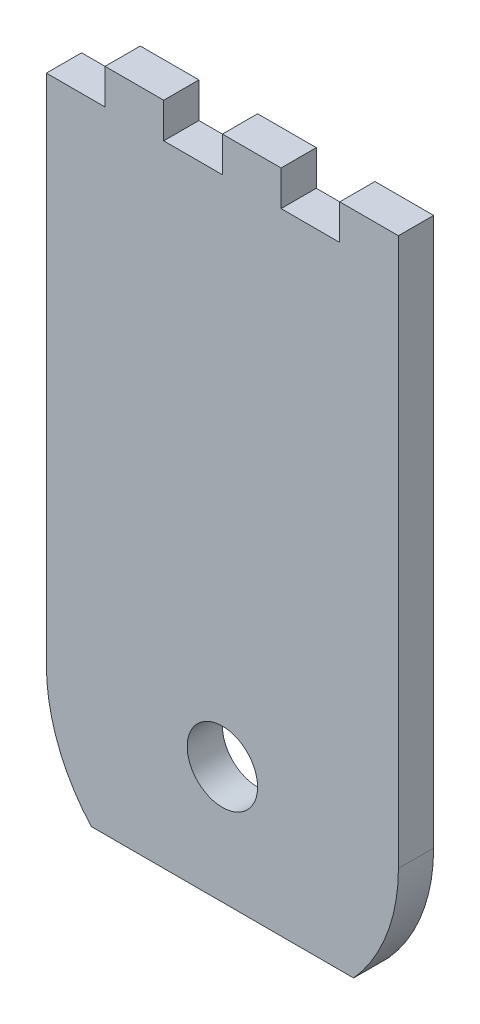
ISO-10303-21;
HEADER;
FILE_DESCRIPTION(('STEP AP214'),'2;1');
FILE_NAME('part.step','',(''),(''),'','','');
FILE_SCHEMA(('AUTOMOTIVE_DESIGN { 1 0 10303 214 1 1 1 1 }'));
ENDSEC;
DATA;
#1=APPLICATION_CONTEXT('core data for automotive mechanical design processes');
#2=APPLICATION_PROTOCOL_DEFINITION('international standard','automotive_design',2000,#1);
#3=PRODUCT_CONTEXT('',#1,'mechanical');
#4=PRODUCT('Part','Part','',(#3));
#5=PRODUCT_RELATED_PRODUCT_CATEGORY('part','',(#4));
#6=PRODUCT_DEFINITION_FORMATION('','',#4);
#7=PRODUCT_DEFINITION_CONTEXT('part definition',#1,'design');
#8=PRODUCT_DEFINITION('design','',#6,#7);
#9=PRODUCT_DEFINITION_SHAPE('','',#8);
#10=(LENGTH_UNIT() NAMED_UNIT(*) SI_UNIT(.MILLI.,.METRE.));
#11=(NAMED_UNIT(*) PLANE_ANGLE_UNIT() SI_UNIT($,.RADIAN.));
#12=(NAMED_UNIT(*) SI_UNIT($,.STERADIAN.) SOLID_ANGLE_UNIT());
#13=UNCERTAINTY_MEASURE_WITH_UNIT(LENGTH_MEASURE(1.E-05),#10,'distance_accuracy_value','');
#14=(GEOMETRIC_REPRESENTATION_CONTEXT(3) GLOBAL_UNCERTAINTY_ASSIGNED_CONTEXT((#13)) GLOBAL_UNIT_ASSIGNED_CONTEXT((#10,
#11,#12)) REPRESENTATION_CONTEXT('',''));
#15=CARTESIAN_POINT('',(0.,0.,0.));
#16=DIRECTION('',(0.,0.,1.));
#17=DIRECTION('',(1.,0.,0.));
#18=AXIS2_PLACEMENT_3D('',#15,#16,#17);
#19=CARTESIAN_POINT('',(0.,0.,3.));
#20=DIRECTION('',(0.,0.,1.));
#21=DIRECTION('',(1.,0.,0.));
#22=AXIS2_PLACEMENT_3D('',#19,#20,#21);
#23=PLANE('',#22);
#24=CARTESIAN_POINT('',(0.,-18.345,3.));
#25=DIRECTION('',(0.,0.,1.));
#26=DIRECTION('',(1.,0.,0.));
#27=AXIS2_PLACEMENT_3D('',#24,#25,#26);
#28=CIRCLE('',#27,3.);
#29=CARTESIAN_POINT('',(3.00000000000001,-18.345,3.));
#30=VERTEX_POINT('',#29);
#31=EDGE_CURVE('E178',#30,#30,#28,.T.);
#32=ORIENTED_EDGE('',*,*,#31,.F.);
#33=EDGE_LOOP('',(#32));
#34=FACE_BOUND('',#33,.T.);
#35=CARTESIAN_POINT('',(0.,-18.345,3.));
#36=DIRECTION('',(0.,0.,1.));
#37=DIRECTION('',(-1.,0.,0.));
#38=AXIS2_PLACEMENT_3D('',#35,#36,#37);
#39=CIRCLE('',#38,15.);
#40=CARTESIAN_POINT('',(11.180339887499,-28.345,3.));
#41=VERTEX_POINT('',#40);
#42=CARTESIAN_POINT('',(15.,-18.345,3.));
#43=VERTEX_POINT('',#42);
#44=EDGE_CURVE('E146',#41,#43,#39,.T.);
#45=ORIENTED_EDGE('',*,*,#44,.T.);
#46=DIRECTION('',(0.,1.,0.));
#47=VECTOR('',#46,1.);
#48=CARTESIAN_POINT('',(15.,-28.345,3.));
#49=LINE('',#48,#47);
#50=CARTESIAN_POINT('',(15.,28.345,3.));
#51=VERTEX_POINT('',#50);
#52=EDGE_CURVE('E157',#43,#51,#49,.T.);
#53=ORIENTED_EDGE('',*,*,#52,.T.);
#54=DIRECTION('',(-1.,0.,0.));
#55=VECTOR('',#54,1.);
#56=CARTESIAN_POINT('',(10.,28.345,3.));
#57=LINE('',#56,#55);
#58=CARTESIAN_POINT('',(10.,28.345,3.));
#59=VERTEX_POINT('',#58);
#60=EDGE_CURVE('E205',#51,#59,#57,.T.);
#61=ORIENTED_EDGE('',*,*,#60,.T.);
#62=DIRECTION('',(0.,-1.,0.));
#63=VECTOR('',#62,1.);
#64=CARTESIAN_POINT('',(10.,25.345,3.));
#65=LINE('',#64,#63);
#66=CARTESIAN_POINT('',(10.,25.345,3.));
#67=VERTEX_POINT('',#66);
#68=EDGE_CURVE('E294',#59,#67,#65,.T.);
#69=ORIENTED_EDGE('',*,*,#68,.T.);
#70=DIRECTION('',(-1.,0.,0.));
#71=VECTOR('',#70,1.);
#72=CARTESIAN_POINT('',(5.,25.345,3.));
#73=LINE('',#72,#71);
#74=CARTESIAN_POINT('',(5.,25.345,3.));
#75=VERTEX_POINT('',#74);
#76=EDGE_CURVE('E239',#67,#75,#73,.T.);
#77=ORIENTED_EDGE('',*,*,#76,.T.);
#78=DIRECTION('',(0.,1.,0.));
#79=VECTOR('',#78,1.);
#80=CARTESIAN_POINT('',(5.,28.345,3.));
#81=LINE('',#80,#79);
#82=CARTESIAN_POINT('',(5.,28.345,3.));
#83=VERTEX_POINT('',#82);
#84=EDGE_CURVE('E258',#75,#83,#81,.T.);
#85=ORIENTED_EDGE('',*,*,#84,.T.);
#86=DIRECTION('',(-1.,0.,0.));
#87=VECTOR('',#86,1.);
#88=CARTESIAN_POINT('',(0.,28.345,3.));
#89=LINE('',#88,#87);
#90=CARTESIAN_POINT('',(0.,28.345,3.));
#91=VERTEX_POINT('',#90);
#92=EDGE_CURVE('E255',#83,#91,#89,.T.);
#93=ORIENTED_EDGE('',*,*,#92,.T.);
#94=DIRECTION('',(0.,-1.,0.));
#95=VECTOR('',#94,1.);
#96=CARTESIAN_POINT('',(0.,25.345,3.));
#97=LINE('',#96,#95);
#98=CARTESIAN_POINT('',(0.,25.345,3.));
#99=VERTEX_POINT('',#98);
#100=EDGE_CURVE('E257',#91,#99,#97,.T.);
#101=ORIENTED_EDGE('',*,*,#100,.T.);
#102=DIRECTION('',(-1.,0.,0.));
#103=VECTOR('',#102,1.);
#104=CARTESIAN_POINT('',(-5.,25.345,3.));
#105=LINE('',#104,#103);
#106=CARTESIAN_POINT('',(-5.,25.345,3.));
#107=VERTEX_POINT('',#106);
#108=EDGE_CURVE('E260',#99,#107,#105,.T.);
#109=ORIENTED_EDGE('',*,*,#108,.T.);
#110=DIRECTION('',(0.,1.,0.));
#111=VECTOR('',#110,1.);
#112=CARTESIAN_POINT('',(-5.,28.345,3.));
#113=LINE('',#112,#111);
#114=CARTESIAN_POINT('',(-5.,28.345,3.));
#115=VERTEX_POINT('',#114);
#116=EDGE_CURVE('E266',#107,#115,#113,.T.);
#117=ORIENTED_EDGE('',*,*,#116,.T.);
#118=DIRECTION('',(-1.,0.,0.));
#119=VECTOR('',#118,1.);
#120=CARTESIAN_POINT('',(-10.,28.345,3.));
#121=LINE('',#120,#119);
#122=CARTESIAN_POINT('',(-10.,28.345,3.));
#123=VERTEX_POINT('',#122);
#124=EDGE_CURVE('E268',#115,#123,#121,.T.);
#125=ORIENTED_EDGE('',*,*,#124,.T.);
#126=DIRECTION('',(0.,-1.,0.));
#127=VECTOR('',#126,1.);
#128=CARTESIAN_POINT('',(-10.,25.345,3.));
#129=LINE('',#128,#127);
#130=CARTESIAN_POINT('',(-10.,25.345,3.));
#131=VERTEX_POINT('',#130);
#132=EDGE_CURVE('E270',#123,#131,#129,.T.);
#133=ORIENTED_EDGE('',*,*,#132,.T.);
#134=DIRECTION('',(-1.,0.,0.));
#135=VECTOR('',#134,1.);
#136=CARTESIAN_POINT('',(-15.,25.345,3.));
#137=LINE('',#136,#135);
#138=CARTESIAN_POINT('',(-15.,25.345,3.));
#139=VERTEX_POINT('',#138);
#140=EDGE_CURVE('E272',#131,#139,#137,.T.);
#141=ORIENTED_EDGE('',*,*,#140,.T.);
#142=DIRECTION('',(0.,-1.,0.));
#143=VECTOR('',#142,1.);
#144=CARTESIAN_POINT('',(-15.,-28.345,3.));
#145=LINE('',#144,#143);
#146=CARTESIAN_POINT('',(-15.,-18.345,3.));
#147=VERTEX_POINT('',#146);
#148=EDGE_CURVE('E170',#139,#147,#145,.T.);
#149=ORIENTED_EDGE('',*,*,#148,.T.);
#150=CARTESIAN_POINT('',(-11.1803398874989,-28.345,3.));
#151=VERTEX_POINT('',#150);
#152=EDGE_CURVE('E152',#147,#151,#39,.T.);
#153=ORIENTED_EDGE('',*,*,#152,.T.);
#154=DIRECTION('',(1.,0.,0.));
#155=VECTOR('',#154,1.);
#156=CARTESIAN_POINT('',(-15.,-28.345,3.));
#157=LINE('',#156,#155);
#158=EDGE_CURVE('E161',#151,#41,#157,.T.);
#159=ORIENTED_EDGE('',*,*,#158,.T.);
#160=EDGE_LOOP('',(#45,#53,#61,#69,#77,#85,#93,#101,#109,#117,#125,#133,#141,#149,#153,#159));
#161=FACE_BOUND('',#160,.T.);
#162=ADVANCED_FACE('F33',(#34,#161),#23,.T.);
#163=CARTESIAN_POINT('',(0.,0.,0.));
#164=DIRECTION('',(0.,0.,1.));
#165=DIRECTION('',(1.,0.,0.));
#166=AXIS2_PLACEMENT_3D('',#163,#164,#165);
#167=PLANE('',#166);
#168=CARTESIAN_POINT('',(0.,-18.345,0.));
#169=DIRECTION('',(0.,0.,1.));
#170=DIRECTION('',(1.,0.,0.));
#171=AXIS2_PLACEMENT_3D('',#168,#169,#170);
#172=CIRCLE('',#171,3.);
#173=CARTESIAN_POINT('',(3.00000000000001,-18.345,0.));
#174=VERTEX_POINT('',#173);
#175=EDGE_CURVE('E288',#174,#174,#172,.T.);
#176=ORIENTED_EDGE('',*,*,#175,.T.);
#177=EDGE_LOOP('',(#176));
#178=FACE_BOUND('',#177,.T.);
#179=DIRECTION('',(0.,1.,0.));
#180=VECTOR('',#179,1.);
#181=CARTESIAN_POINT('',(15.,-28.345,0.));
#182=LINE('',#181,#180);
#183=CARTESIAN_POINT('',(15.,-18.345,0.));
#184=VERTEX_POINT('',#183);
#185=CARTESIAN_POINT('',(15.,28.345,0.));
#186=VERTEX_POINT('',#185);
#187=EDGE_CURVE('E204',#184,#186,#182,.T.);
#188=ORIENTED_EDGE('',*,*,#187,.F.);
#189=CARTESIAN_POINT('',(0.,-18.345,0.));
#190=DIRECTION('',(0.,0.,1.));
#191=DIRECTION('',(-1.,0.,0.));
#192=AXIS2_PLACEMENT_3D('',#189,#190,#191);
#193=CIRCLE('',#192,15.);
#194=CARTESIAN_POINT('',(11.180339887499,-28.345,0.));
#195=VERTEX_POINT('',#194);
#196=EDGE_CURVE('E56',#195,#184,#193,.T.);
#197=ORIENTED_EDGE('',*,*,#196,.F.);
#198=DIRECTION('',(1.,0.,0.));
#199=VECTOR('',#198,1.);
#200=CARTESIAN_POINT('',(-15.,-28.345,0.));
#201=LINE('',#200,#199);
#202=CARTESIAN_POINT('',(-11.1803398874989,-28.345,0.));
#203=VERTEX_POINT('',#202);
#204=EDGE_CURVE('E201',#203,#195,#201,.T.);
#205=ORIENTED_EDGE('',*,*,#204,.F.);
#206=CARTESIAN_POINT('',(-15.,-18.345,0.));
#207=VERTEX_POINT('',#206);
#208=EDGE_CURVE('E48',#207,#203,#193,.T.);
#209=ORIENTED_EDGE('',*,*,#208,.F.);
#210=DIRECTION('',(0.,-1.,0.));
#211=VECTOR('',#210,1.);
#212=CARTESIAN_POINT('',(-15.,-28.345,0.));
#213=LINE('',#212,#211);
#214=CARTESIAN_POINT('',(-15.,25.345,0.));
#215=VERTEX_POINT('',#214);
#216=EDGE_CURVE('E198',#215,#207,#213,.T.);
#217=ORIENTED_EDGE('',*,*,#216,.F.);
#218=DIRECTION('',(-1.,0.,0.));
#219=VECTOR('',#218,1.);
#220=CARTESIAN_POINT('',(-15.,25.345,0.));
#221=LINE('',#220,#219);
#222=CARTESIAN_POINT('',(-10.,25.345,0.));
#223=VERTEX_POINT('',#222);
#224=EDGE_CURVE('E196',#223,#215,#221,.T.);
#225=ORIENTED_EDGE('',*,*,#224,.F.);
#226=DIRECTION('',(0.,-1.,0.));
#227=VECTOR('',#226,1.);
#228=CARTESIAN_POINT('',(-10.,25.345,0.));
#229=LINE('',#228,#227);
#230=CARTESIAN_POINT('',(-10.,28.345,0.));
#231=VERTEX_POINT('',#230);
#232=EDGE_CURVE('E194',#231,#223,#229,.T.);
#233=ORIENTED_EDGE('',*,*,#232,.F.);
#234=DIRECTION('',(-1.,0.,0.));
#235=VECTOR('',#234,1.);
#236=CARTESIAN_POINT('',(-10.,28.345,0.));
#237=LINE('',#236,#235);
#238=CARTESIAN_POINT('',(-5.,28.345,0.));
#239=VERTEX_POINT('',#238);
#240=EDGE_CURVE('E192',#239,#231,#237,.T.);
#241=ORIENTED_EDGE('',*,*,#240,.F.);
#242=DIRECTION('',(0.,1.,0.));
#243=VECTOR('',#242,1.);
#244=CARTESIAN_POINT('',(-5.,28.345,0.));
#245=LINE('',#244,#243);
#246=CARTESIAN_POINT('',(-5.,25.345,0.));
#247=VERTEX_POINT('',#246);
#248=EDGE_CURVE('E190',#247,#239,#245,.T.);
#249=ORIENTED_EDGE('',*,*,#248,.F.);
#250=DIRECTION('',(-1.,0.,0.));
#251=VECTOR('',#250,1.);
#252=CARTESIAN_POINT('',(-5.,25.345,0.));
#253=LINE('',#252,#251);
#254=CARTESIAN_POINT('',(0.,25.345,0.));
#255=VERTEX_POINT('',#254);
#256=EDGE_CURVE('E188',#255,#247,#253,.T.);
#257=ORIENTED_EDGE('',*,*,#256,.F.);
#258=DIRECTION('',(0.,-1.,0.));
#259=VECTOR('',#258,1.);
#260=CARTESIAN_POINT('',(0.,25.345,0.));
#261=LINE('',#260,#259);
#262=CARTESIAN_POINT('',(0.,28.345,0.));
#263=VERTEX_POINT('',#262);
#264=EDGE_CURVE('E186',#263,#255,#261,.T.);
#265=ORIENTED_EDGE('',*,*,#264,.F.);
#266=DIRECTION('',(-1.,0.,0.));
#267=VECTOR('',#266,1.);
#268=CARTESIAN_POINT('',(0.,28.345,0.));
#269=LINE('',#268,#267);
#270=CARTESIAN_POINT('',(5.,28.345,0.));
#271=VERTEX_POINT('',#270);
#272=EDGE_CURVE('E184',#271,#263,#269,.T.);
#273=ORIENTED_EDGE('',*,*,#272,.F.);
#274=DIRECTION('',(0.,1.,0.));
#275=VECTOR('',#274,1.);
#276=CARTESIAN_POINT('',(5.,28.345,0.));
#277=LINE('',#276,#275);
#278=CARTESIAN_POINT('',(5.,25.345,0.));
#279=VERTEX_POINT('',#278);
#280=EDGE_CURVE('E182',#279,#271,#277,.T.);
#281=ORIENTED_EDGE('',*,*,#280,.F.);
#282=DIRECTION('',(-1.,0.,0.));
#283=VECTOR('',#282,1.);
#284=CARTESIAN_POINT('',(5.,25.345,0.));
#285=LINE('',#284,#283);
#286=CARTESIAN_POINT('',(10.,25.345,0.));
#287=VERTEX_POINT('',#286);
#288=EDGE_CURVE('E180',#287,#279,#285,.T.);
#289=ORIENTED_EDGE('',*,*,#288,.F.);
#290=DIRECTION('',(0.,-1.,0.));
#291=VECTOR('',#290,1.);
#292=CARTESIAN_POINT('',(10.,25.345,0.));
#293=LINE('',#292,#291);
#294=CARTESIAN_POINT('',(10.,28.345,0.));
#295=VERTEX_POINT('',#294);
#296=EDGE_CURVE('E177',#295,#287,#293,.T.);
#297=ORIENTED_EDGE('',*,*,#296,.F.);
#298=DIRECTION('',(-1.,0.,0.));
#299=VECTOR('',#298,1.);
#300=CARTESIAN_POINT('',(10.,28.345,0.));
#301=LINE('',#300,#299);
#302=EDGE_CURVE('E174',#186,#295,#301,.T.);
#303=ORIENTED_EDGE('',*,*,#302,.F.);
#304=EDGE_LOOP('',(#188,#197,#205,#209,#217,#225,#233,#241,#249,#257,#265,#273,#281,#289,#297,#303));
#305=FACE_BOUND('',#304,.T.);
#306=ADVANCED_FACE('F243',(#178,#305),#167,.F.);
#307=CARTESIAN_POINT('',(10.,28.345,3.));
#308=DIRECTION('',(0.,-1.,0.));
#309=DIRECTION('',(0.,0.,-1.));
#310=AXIS2_PLACEMENT_3D('',#307,#308,#309);
#311=PLANE('',#310);
#312=ORIENTED_EDGE('',*,*,#302,.T.);
#313=DIRECTION('',(0.,0.,-1.));
#314=VECTOR('',#313,1.);
#315=CARTESIAN_POINT('',(10.,28.345,3.));
#316=LINE('',#315,#314);
#317=EDGE_CURVE('E11',#59,#295,#316,.T.);
#318=ORIENTED_EDGE('',*,*,#317,.F.);
#319=ORIENTED_EDGE('',*,*,#60,.F.);
#320=DIRECTION('',(0.,0.,-1.));
#321=VECTOR('',#320,1.);
#322=CARTESIAN_POINT('',(15.,28.345,3.));
#323=LINE('',#322,#321);
#324=EDGE_CURVE('E165',#51,#186,#323,.T.);
#325=ORIENTED_EDGE('',*,*,#324,.T.);
#326=EDGE_LOOP('',(#312,#318,#319,#325));
#327=FACE_BOUND('',#326,.T.);
#328=ADVANCED_FACE('F35',(#327),#311,.F.);
#329=CARTESIAN_POINT('',(10.,25.345,3.));
#330=DIRECTION('',(1.,0.,0.));
#331=DIRECTION('',(0.,0.,-1.));
#332=AXIS2_PLACEMENT_3D('',#329,#330,#331);
#333=PLANE('',#332);
#334=ORIENTED_EDGE('',*,*,#296,.T.);
#335=DIRECTION('',(0.,0.,-1.));
#336=VECTOR('',#335,1.);
#337=CARTESIAN_POINT('',(10.,25.345,3.));
#338=LINE('',#337,#336);
#339=EDGE_CURVE('E41',#67,#287,#338,.T.);
#340=ORIENTED_EDGE('',*,*,#339,.F.);
#341=ORIENTED_EDGE('',*,*,#68,.F.);
#342=ORIENTED_EDGE('',*,*,#317,.T.);
#343=EDGE_LOOP('',(#334,#340,#341,#342));
#344=FACE_BOUND('',#343,.T.);
#345=ADVANCED_FACE('F296',(#344),#333,.F.);
#346=CARTESIAN_POINT('',(5.,25.345,3.));
#347=DIRECTION('',(0.,-1.,0.));
#348=DIRECTION('',(0.,0.,-1.));
#349=AXIS2_PLACEMENT_3D('',#346,#347,#348);
#350=PLANE('',#349);
#351=ORIENTED_EDGE('',*,*,#288,.T.);
#352=DIRECTION('',(0.,0.,-1.));
#353=VECTOR('',#352,1.);
#354=CARTESIAN_POINT('',(5.,25.345,3.));
#355=LINE('',#354,#353);
#356=EDGE_CURVE('E230',#75,#279,#355,.T.);
#357=ORIENTED_EDGE('',*,*,#356,.F.);
#358=ORIENTED_EDGE('',*,*,#76,.F.);
#359=ORIENTED_EDGE('',*,*,#339,.T.);
#360=EDGE_LOOP('',(#351,#357,#358,#359));
#361=FACE_BOUND('',#360,.T.);
#362=ADVANCED_FACE('F237',(#361),#350,.F.);
#363=CARTESIAN_POINT('',(5.,28.345,3.));
#364=DIRECTION('',(-1.,0.,0.));
#365=DIRECTION('',(0.,0.,1.));
#366=AXIS2_PLACEMENT_3D('',#363,#364,#365);
#367=PLANE('',#366);
#368=ORIENTED_EDGE('',*,*,#280,.T.);
#369=DIRECTION('',(0.,0.,-1.));
#370=VECTOR('',#369,1.);
#371=CARTESIAN_POINT('',(5.,28.345,3.));
#372=LINE('',#371,#370);
#373=EDGE_CURVE('E227',#83,#271,#372,.T.);
#374=ORIENTED_EDGE('',*,*,#373,.F.);
#375=ORIENTED_EDGE('',*,*,#84,.F.);
#376=ORIENTED_EDGE('',*,*,#356,.T.);
#377=EDGE_LOOP('',(#368,#374,#375,#376));
#378=FACE_BOUND('',#377,.T.);
#379=ADVANCED_FACE('F249',(#378),#367,.F.);
#380=CARTESIAN_POINT('',(0.,28.345,3.));
#381=DIRECTION('',(0.,-1.,0.));
#382=DIRECTION('',(0.,0.,-1.));
#383=AXIS2_PLACEMENT_3D('',#380,#381,#382);
#384=PLANE('',#383);
#385=ORIENTED_EDGE('',*,*,#272,.T.);
#386=DIRECTION('',(0.,0.,-1.));
#387=VECTOR('',#386,1.);
#388=CARTESIAN_POINT('',(0.,28.345,3.));
#389=LINE('',#388,#387);
#390=EDGE_CURVE('E224',#91,#263,#389,.T.);
#391=ORIENTED_EDGE('',*,*,#390,.F.);
#392=ORIENTED_EDGE('',*,*,#92,.F.);
#393=ORIENTED_EDGE('',*,*,#373,.T.);
#394=EDGE_LOOP('',(#385,#391,#392,#393));
#395=FACE_BOUND('',#394,.T.);
#396=ADVANCED_FACE('F253',(#395),#384,.F.);
#397=CARTESIAN_POINT('',(0.,25.345,3.));
#398=DIRECTION('',(1.,0.,0.));
#399=DIRECTION('',(0.,0.,-1.));
#400=AXIS2_PLACEMENT_3D('',#397,#398,#399);
#401=PLANE('',#400);
#402=ORIENTED_EDGE('',*,*,#264,.T.);
#403=DIRECTION('',(0.,0.,-1.));
#404=VECTOR('',#403,1.);
#405=CARTESIAN_POINT('',(0.,25.345,3.));
#406=LINE('',#405,#404);
#407=EDGE_CURVE('E221',#99,#255,#406,.T.);
#408=ORIENTED_EDGE('',*,*,#407,.F.);
#409=ORIENTED_EDGE('',*,*,#100,.F.);
#410=ORIENTED_EDGE('',*,*,#390,.T.);
#411=EDGE_LOOP('',(#402,#408,#409,#410));
#412=FACE_BOUND('',#411,.T.);
#413=ADVANCED_FACE('F344',(#412),#401,.F.);
#414=CARTESIAN_POINT('',(-5.,25.345,3.));
#415=DIRECTION('',(0.,-1.,0.));
#416=DIRECTION('',(0.,0.,-1.));
#417=AXIS2_PLACEMENT_3D('',#414,#415,#416);
#418=PLANE('',#417);
#419=ORIENTED_EDGE('',*,*,#256,.T.);
#420=DIRECTION('',(0.,0.,-1.));
#421=VECTOR('',#420,1.);
#422=CARTESIAN_POINT('',(-5.,25.345,3.));
#423=LINE('',#422,#421);
#424=EDGE_CURVE('E218',#107,#247,#423,.T.);
#425=ORIENTED_EDGE('',*,*,#424,.F.);
#426=ORIENTED_EDGE('',*,*,#108,.F.);
#427=ORIENTED_EDGE('',*,*,#407,.T.);
#428=EDGE_LOOP('',(#419,#425,#426,#427));
#429=FACE_BOUND('',#428,.T.);
#430=ADVANCED_FACE('F340',(#429),#418,.F.);
#431=CARTESIAN_POINT('',(-5.,28.345,3.));
#432=DIRECTION('',(-1.,0.,0.));
#433=DIRECTION('',(0.,0.,1.));
#434=AXIS2_PLACEMENT_3D('',#431,#432,#433);
#435=PLANE('',#434);
#436=ORIENTED_EDGE('',*,*,#248,.T.);
#437=DIRECTION('',(0.,0.,-1.));
#438=VECTOR('',#437,1.);
#439=CARTESIAN_POINT('',(-5.,28.345,3.));
#440=LINE('',#439,#438);
#441=EDGE_CURVE('E215',#115,#239,#440,.T.);
#442=ORIENTED_EDGE('',*,*,#441,.F.);
#443=ORIENTED_EDGE('',*,*,#116,.F.);
#444=ORIENTED_EDGE('',*,*,#424,.T.);
#445=EDGE_LOOP('',(#436,#442,#443,#444));
#446=FACE_BOUND('',#445,.T.);
#447=ADVANCED_FACE('F336',(#446),#435,.F.);
#448=CARTESIAN_POINT('',(-10.,28.345,3.));
#449=DIRECTION('',(0.,-1.,0.));
#450=DIRECTION('',(0.,0.,-1.));
#451=AXIS2_PLACEMENT_3D('',#448,#449,#450);
#452=PLANE('',#451);
#453=ORIENTED_EDGE('',*,*,#240,.T.);
#454=DIRECTION('',(0.,0.,-1.));
#455=VECTOR('',#454,1.);
#456=CARTESIAN_POINT('',(-10.,28.345,3.));
#457=LINE('',#456,#455);
#458=EDGE_CURVE('E212',#123,#231,#457,.T.);
#459=ORIENTED_EDGE('',*,*,#458,.F.);
#460=ORIENTED_EDGE('',*,*,#124,.F.);
#461=ORIENTED_EDGE('',*,*,#441,.T.);
#462=EDGE_LOOP('',(#453,#459,#460,#461));
#463=FACE_BOUND('',#462,.T.);
#464=ADVANCED_FACE('F332',(#463),#452,.F.);
#465=CARTESIAN_POINT('',(-10.,25.345,3.));
#466=DIRECTION('',(1.,0.,0.));
#467=DIRECTION('',(0.,0.,-1.));
#468=AXIS2_PLACEMENT_3D('',#465,#466,#467);
#469=PLANE('',#468);
#470=ORIENTED_EDGE('',*,*,#232,.T.);
#471=DIRECTION('',(0.,0.,-1.));
#472=VECTOR('',#471,1.);
#473=CARTESIAN_POINT('',(-10.,25.345,3.));
#474=LINE('',#473,#472);
#475=EDGE_CURVE('E209',#131,#223,#474,.T.);
#476=ORIENTED_EDGE('',*,*,#475,.F.);
#477=ORIENTED_EDGE('',*,*,#132,.F.);
#478=ORIENTED_EDGE('',*,*,#458,.T.);
#479=EDGE_LOOP('',(#470,#476,#477,#478));
#480=FACE_BOUND('',#479,.T.);
#481=ADVANCED_FACE('F328',(#480),#469,.F.);
#482=CARTESIAN_POINT('',(-15.,25.345,3.));
#483=DIRECTION('',(0.,-1.,0.));
#484=DIRECTION('',(1.,0.,0.));
#485=AXIS2_PLACEMENT_3D('',#482,#483,#484);
#486=PLANE('',#485);
#487=ORIENTED_EDGE('',*,*,#224,.T.);
#488=DIRECTION('',(0.,0.,-1.));
#489=VECTOR('',#488,1.);
#490=CARTESIAN_POINT('',(-15.,25.345,3.));
#491=LINE('',#490,#489);
#492=EDGE_CURVE('E168',#139,#215,#491,.T.);
#493=ORIENTED_EDGE('',*,*,#492,.F.);
#494=ORIENTED_EDGE('',*,*,#140,.F.);
#495=ORIENTED_EDGE('',*,*,#475,.T.);
#496=EDGE_LOOP('',(#487,#493,#494,#495));
#497=FACE_BOUND('',#496,.T.);
#498=ADVANCED_FACE('F325',(#497),#486,.F.);
#499=CARTESIAN_POINT('',(-15.,-28.345,3.));
#500=DIRECTION('',(1.,0.,0.));
#501=DIRECTION('',(0.,0.,-1.));
#502=AXIS2_PLACEMENT_3D('',#499,#500,#501);
#503=PLANE('',#502);
#504=ORIENTED_EDGE('',*,*,#216,.T.);
#505=DIRECTION('',(0.,0.,-1.));
#506=VECTOR('',#505,1.);
#507=CARTESIAN_POINT('',(-15.,-18.345,3.));
#508=LINE('',#507,#506);
#509=EDGE_CURVE('E151',#147,#207,#508,.T.);
#510=ORIENTED_EDGE('',*,*,#509,.F.);
#511=ORIENTED_EDGE('',*,*,#148,.F.);
#512=ORIENTED_EDGE('',*,*,#492,.T.);
#513=EDGE_LOOP('',(#504,#510,#511,#512));
#514=FACE_BOUND('',#513,.T.);
#515=ADVANCED_FACE('F279',(#514),#503,.F.);
#516=CARTESIAN_POINT('',(-15.,-28.345,3.));
#517=DIRECTION('',(0.,1.,0.));
#518=DIRECTION('',(0.,0.,1.));
#519=AXIS2_PLACEMENT_3D('',#516,#517,#518);
#520=PLANE('',#519);
#521=ORIENTED_EDGE('',*,*,#204,.T.);
#522=DIRECTION('',(0.,0.,-1.));
#523=VECTOR('',#522,1.);
#524=CARTESIAN_POINT('',(11.180339887499,-28.345,3.));
#525=LINE('',#524,#523);
#526=EDGE_CURVE('E283',#195,#41,#525,.F.);
#527=ORIENTED_EDGE('',*,*,#526,.T.);
#528=ORIENTED_EDGE('',*,*,#158,.F.);
#529=DIRECTION('',(0.,0.,-1.));
#530=VECTOR('',#529,1.);
#531=CARTESIAN_POINT('',(-11.1803398874989,-28.345,3.));
#532=LINE('',#531,#530);
#533=EDGE_CURVE('E281',#151,#203,#532,.T.);
#534=ORIENTED_EDGE('',*,*,#533,.T.);
#535=EDGE_LOOP('',(#521,#527,#528,#534));
#536=FACE_BOUND('',#535,.T.);
#537=ADVANCED_FACE('F300',(#536),#520,.F.);
#538=CARTESIAN_POINT('',(15.,-28.345,3.));
#539=DIRECTION('',(-1.,0.,0.));
#540=DIRECTION('',(0.,0.,1.));
#541=AXIS2_PLACEMENT_3D('',#538,#539,#540);
#542=PLANE('',#541);
#543=ORIENTED_EDGE('',*,*,#52,.F.);
#544=DIRECTION('',(0.,0.,-1.));
#545=VECTOR('',#544,1.);
#546=CARTESIAN_POINT('',(15.,-18.345,3.));
#547=LINE('',#546,#545);
#548=EDGE_CURVE('E143',#43,#184,#547,.T.);
#549=ORIENTED_EDGE('',*,*,#548,.T.);
#550=ORIENTED_EDGE('',*,*,#187,.T.);
#551=ORIENTED_EDGE('',*,*,#324,.F.);
#552=EDGE_LOOP('',(#543,#549,#550,#551));
#553=FACE_BOUND('',#552,.T.);
#554=ADVANCED_FACE('F163',(#553),#542,.F.);
#555=CARTESIAN_POINT('',(0.,-18.345,3.));
#556=DIRECTION('',(0.,0.,-1.));
#557=DIRECTION('',(-1.,0.,0.));
#558=AXIS2_PLACEMENT_3D('',#555,#556,#557);
#559=CYLINDRICAL_SURFACE('',#558,3.);
#560=ORIENTED_EDGE('',*,*,#31,.T.);
#561=EDGE_LOOP('',(#560));
#562=FACE_BOUND('',#561,.T.);
#563=ORIENTED_EDGE('',*,*,#175,.F.);
#564=EDGE_LOOP('',(#563));
#565=FACE_BOUND('',#564,.T.);
#566=ADVANCED_FACE('F307',(#562,#565),#559,.F.);
#567=CARTESIAN_POINT('',(0.,-18.345,3.));
#568=DIRECTION('',(0.,0.,-1.));
#569=DIRECTION('',(-1.,0.,0.));
#570=AXIS2_PLACEMENT_3D('',#567,#568,#569);
#571=CYLINDRICAL_SURFACE('',#570,15.);
#572=ORIENTED_EDGE('',*,*,#196,.T.);
#573=ORIENTED_EDGE('',*,*,#548,.F.);
#574=ORIENTED_EDGE('',*,*,#44,.F.);
#575=ORIENTED_EDGE('',*,*,#526,.F.);
#576=EDGE_LOOP('',(#572,#573,#574,#575));
#577=FACE_BOUND('',#576,.T.);
#578=ADVANCED_FACE('F145',(#577),#571,.T.);
#579=ORIENTED_EDGE('',*,*,#152,.F.);
#580=ORIENTED_EDGE('',*,*,#509,.T.);
#581=ORIENTED_EDGE('',*,*,#208,.T.);
#582=ORIENTED_EDGE('',*,*,#533,.F.);
#583=EDGE_LOOP('',(#579,#580,#581,#582));
#584=FACE_BOUND('',#583,.T.);
#585=ADVANCED_FACE('F301',(#584),#571,.T.);
#586=CLOSED_SHELL('',(#162,#306,#328,#345,#362,#379,#396,#413,#430,#447,#464,#481,#498,#515,
#537,#554,#566,#578,#585));
#587=MANIFOLD_SOLID_BREP('B2',#586);
#588=ADVANCED_BREP_SHAPE_REPRESENTATION('',(#18,#587),#14);
#589=SHAPE_DEFINITION_REPRESENTATION(#9,#588);
ENDSEC;
END-ISO-10303-21;
